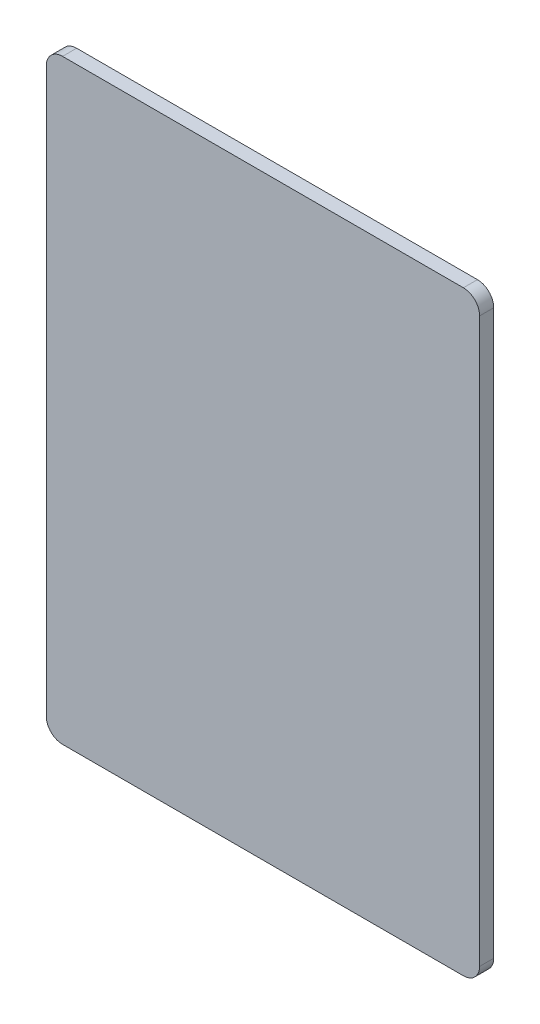
ISO-10303-21;
HEADER;
FILE_DESCRIPTION(('STEP AP214'),'2;1');
FILE_NAME('part.step','',(''),(''),'','','');
FILE_SCHEMA(('AUTOMOTIVE_DESIGN { 1 0 10303 214 1 1 1 1 }'));
ENDSEC;
DATA;
#1=APPLICATION_CONTEXT('core data for automotive mechanical design processes');
#2=APPLICATION_PROTOCOL_DEFINITION('international standard','automotive_design',2000,#1);
#3=PRODUCT_CONTEXT('',#1,'mechanical');
#4=PRODUCT('Part','Part','',(#3));
#5=PRODUCT_RELATED_PRODUCT_CATEGORY('part','',(#4));
#6=PRODUCT_DEFINITION_FORMATION('','',#4);
#7=PRODUCT_DEFINITION_CONTEXT('part definition',#1,'design');
#8=PRODUCT_DEFINITION('design','',#6,#7);
#9=PRODUCT_DEFINITION_SHAPE('','',#8);
#10=(LENGTH_UNIT() NAMED_UNIT(*) SI_UNIT(.MILLI.,.METRE.));
#11=(NAMED_UNIT(*) PLANE_ANGLE_UNIT() SI_UNIT($,.RADIAN.));
#12=(NAMED_UNIT(*) SI_UNIT($,.STERADIAN.) SOLID_ANGLE_UNIT());
#13=UNCERTAINTY_MEASURE_WITH_UNIT(LENGTH_MEASURE(1.E-05),#10,'distance_accuracy_value','');
#14=(GEOMETRIC_REPRESENTATION_CONTEXT(3) GLOBAL_UNCERTAINTY_ASSIGNED_CONTEXT((#13)) GLOBAL_UNIT_ASSIGNED_CONTEXT((#10,
#11,#12)) REPRESENTATION_CONTEXT('',''));
#15=CARTESIAN_POINT('',(0.,0.,0.));
#16=DIRECTION('',(0.,0.,1.));
#17=DIRECTION('',(1.,0.,0.));
#18=AXIS2_PLACEMENT_3D('',#15,#16,#17);
#19=CARTESIAN_POINT('',(20.,27.5,1.3));
#20=DIRECTION('',(0.,-1.,0.));
#21=DIRECTION('',(0.,0.,-1.));
#22=AXIS2_PLACEMENT_3D('',#19,#20,#21);
#23=PLANE('',#22);
#24=DIRECTION('',(-1.,0.,0.));
#25=VECTOR('',#24,1.);
#26=CARTESIAN_POINT('',(20.,27.5,0.));
#27=LINE('',#26,#25);
#28=CARTESIAN_POINT('',(18.5,27.5,0.));
#29=VERTEX_POINT('',#28);
#30=CARTESIAN_POINT('',(-18.5,27.5,0.));
#31=VERTEX_POINT('',#30);
#32=EDGE_CURVE('E142',#29,#31,#27,.T.);
#33=ORIENTED_EDGE('',*,*,#32,.T.);
#34=DIRECTION('',(0.,0.,-1.));
#35=VECTOR('',#34,1.);
#36=CARTESIAN_POINT('',(-18.5,27.5,1.3));
#37=LINE('',#36,#35);
#38=CARTESIAN_POINT('',(-18.5,27.5,1.3));
#39=VERTEX_POINT('',#38);
#40=EDGE_CURVE('E117',#31,#39,#37,.F.);
#41=ORIENTED_EDGE('',*,*,#40,.T.);
#42=DIRECTION('',(-1.,0.,0.));
#43=VECTOR('',#42,1.);
#44=CARTESIAN_POINT('',(20.,27.5,1.3));
#45=LINE('',#44,#43);
#46=CARTESIAN_POINT('',(18.5,27.5,1.3));
#47=VERTEX_POINT('',#46);
#48=EDGE_CURVE('E154',#47,#39,#45,.T.);
#49=ORIENTED_EDGE('',*,*,#48,.F.);
#50=DIRECTION('',(0.,0.,-1.));
#51=VECTOR('',#50,1.);
#52=CARTESIAN_POINT('',(18.5,27.5,1.3));
#53=LINE('',#52,#51);
#54=EDGE_CURVE('E123',#47,#29,#53,.T.);
#55=ORIENTED_EDGE('',*,*,#54,.T.);
#56=EDGE_LOOP('',(#33,#41,#49,#55));
#57=FACE_BOUND('',#56,.T.);
#58=ADVANCED_FACE('F46',(#57),#23,.F.);
#59=CARTESIAN_POINT('',(-20.,-27.5,1.3));
#60=DIRECTION('',(1.,0.,0.));
#61=DIRECTION('',(0.,0.,-1.));
#62=AXIS2_PLACEMENT_3D('',#59,#60,#61);
#63=PLANE('',#62);
#64=DIRECTION('',(0.,-1.,0.));
#65=VECTOR('',#64,1.);
#66=CARTESIAN_POINT('',(-20.,-27.5,1.3));
#67=LINE('',#66,#65);
#68=CARTESIAN_POINT('',(-20.,26.,1.3));
#69=VERTEX_POINT('',#68);
#70=CARTESIAN_POINT('',(-20.,-26.,1.3));
#71=VERTEX_POINT('',#70);
#72=EDGE_CURVE('E133',#69,#71,#67,.T.);
#73=ORIENTED_EDGE('',*,*,#72,.F.);
#74=DIRECTION('',(0.,0.,-1.));
#75=VECTOR('',#74,1.);
#76=CARTESIAN_POINT('',(-20.,26.,1.3));
#77=LINE('',#76,#75);
#78=CARTESIAN_POINT('',(-20.,26.,0.));
#79=VERTEX_POINT('',#78);
#80=EDGE_CURVE('E116',#69,#79,#77,.T.);
#81=ORIENTED_EDGE('',*,*,#80,.T.);
#82=DIRECTION('',(0.,-1.,0.));
#83=VECTOR('',#82,1.);
#84=CARTESIAN_POINT('',(-20.,-27.5,0.));
#85=LINE('',#84,#83);
#86=CARTESIAN_POINT('',(-20.,-26.,0.));
#87=VERTEX_POINT('',#86);
#88=EDGE_CURVE('E130',#79,#87,#85,.T.);
#89=ORIENTED_EDGE('',*,*,#88,.T.);
#90=DIRECTION('',(0.,0.,-1.));
#91=VECTOR('',#90,1.);
#92=CARTESIAN_POINT('',(-20.,-26.,1.3));
#93=LINE('',#92,#91);
#94=EDGE_CURVE('E136',#87,#71,#93,.F.);
#95=ORIENTED_EDGE('',*,*,#94,.T.);
#96=EDGE_LOOP('',(#73,#81,#89,#95));
#97=FACE_BOUND('',#96,.T.);
#98=ADVANCED_FACE('F129',(#97),#63,.F.);
#99=CARTESIAN_POINT('',(20.,-27.5,1.3));
#100=DIRECTION('',(0.,1.,0.));
#101=DIRECTION('',(0.,0.,1.));
#102=AXIS2_PLACEMENT_3D('',#99,#100,#101);
#103=PLANE('',#102);
#104=DIRECTION('',(1.,0.,0.));
#105=VECTOR('',#104,1.);
#106=CARTESIAN_POINT('',(20.,-27.5,1.3));
#107=LINE('',#106,#105);
#108=CARTESIAN_POINT('',(-18.5,-27.5,1.3));
#109=VERTEX_POINT('',#108);
#110=CARTESIAN_POINT('',(18.5,-27.5,1.3));
#111=VERTEX_POINT('',#110);
#112=EDGE_CURVE('E203',#109,#111,#107,.T.);
#113=ORIENTED_EDGE('',*,*,#112,.F.);
#114=DIRECTION('',(0.,0.,-1.));
#115=VECTOR('',#114,1.);
#116=CARTESIAN_POINT('',(-18.5,-27.5,1.3));
#117=LINE('',#116,#115);
#118=CARTESIAN_POINT('',(-18.5,-27.5,0.));
#119=VERTEX_POINT('',#118);
#120=EDGE_CURVE('E184',#109,#119,#117,.T.);
#121=ORIENTED_EDGE('',*,*,#120,.T.);
#122=DIRECTION('',(1.,0.,0.));
#123=VECTOR('',#122,1.);
#124=CARTESIAN_POINT('',(20.,-27.5,0.));
#125=LINE('',#124,#123);
#126=CARTESIAN_POINT('',(18.5,-27.5,0.));
#127=VERTEX_POINT('',#126);
#128=EDGE_CURVE('E141',#119,#127,#125,.T.);
#129=ORIENTED_EDGE('',*,*,#128,.T.);
#130=DIRECTION('',(0.,0.,-1.));
#131=VECTOR('',#130,1.);
#132=CARTESIAN_POINT('',(18.5,-27.5,1.3));
#133=LINE('',#132,#131);
#134=EDGE_CURVE('E181',#127,#111,#133,.F.);
#135=ORIENTED_EDGE('',*,*,#134,.T.);
#136=EDGE_LOOP('',(#113,#121,#129,#135));
#137=FACE_BOUND('',#136,.T.);
#138=ADVANCED_FACE('F217',(#137),#103,.F.);
#139=CARTESIAN_POINT('',(20.,-27.5,1.3));
#140=DIRECTION('',(-1.,0.,0.));
#141=DIRECTION('',(0.,0.,1.));
#142=AXIS2_PLACEMENT_3D('',#139,#140,#141);
#143=PLANE('',#142);
#144=DIRECTION('',(0.,1.,0.));
#145=VECTOR('',#144,1.);
#146=CARTESIAN_POINT('',(20.,-27.5,0.));
#147=LINE('',#146,#145);
#148=CARTESIAN_POINT('',(20.,-26.,0.));
#149=VERTEX_POINT('',#148);
#150=CARTESIAN_POINT('',(20.,26.,0.));
#151=VERTEX_POINT('',#150);
#152=EDGE_CURVE('E147',#149,#151,#147,.T.);
#153=ORIENTED_EDGE('',*,*,#152,.T.);
#154=DIRECTION('',(0.,0.,-1.));
#155=VECTOR('',#154,1.);
#156=CARTESIAN_POINT('',(20.,26.,1.3));
#157=LINE('',#156,#155);
#158=CARTESIAN_POINT('',(20.,26.,1.3));
#159=VERTEX_POINT('',#158);
#160=EDGE_CURVE('E11',#151,#159,#157,.F.);
#161=ORIENTED_EDGE('',*,*,#160,.T.);
#162=DIRECTION('',(0.,1.,0.));
#163=VECTOR('',#162,1.);
#164=CARTESIAN_POINT('',(20.,-27.5,1.3));
#165=LINE('',#164,#163);
#166=CARTESIAN_POINT('',(20.,-26.,1.3));
#167=VERTEX_POINT('',#166);
#168=EDGE_CURVE('E156',#167,#159,#165,.T.);
#169=ORIENTED_EDGE('',*,*,#168,.F.);
#170=DIRECTION('',(0.,0.,-1.));
#171=VECTOR('',#170,1.);
#172=CARTESIAN_POINT('',(20.,-26.,1.3));
#173=LINE('',#172,#171);
#174=EDGE_CURVE('E55',#167,#149,#173,.T.);
#175=ORIENTED_EDGE('',*,*,#174,.T.);
#176=EDGE_LOOP('',(#153,#161,#169,#175));
#177=FACE_BOUND('',#176,.T.);
#178=ADVANCED_FACE('F191',(#177),#143,.F.);
#179=CARTESIAN_POINT('',(0.,0.,1.3));
#180=DIRECTION('',(0.,0.,-1.));
#181=DIRECTION('',(-1.,0.,0.));
#182=AXIS2_PLACEMENT_3D('',#179,#180,#181);
#183=PLANE('',#182);
#184=ORIENTED_EDGE('',*,*,#48,.T.);
#185=CARTESIAN_POINT('',(-18.5,26.,1.3));
#186=DIRECTION('',(0.,0.,-1.));
#187=DIRECTION('',(-1.,0.,0.));
#188=AXIS2_PLACEMENT_3D('',#185,#186,#187);
#189=CIRCLE('',#188,1.5);
#190=EDGE_CURVE('E178',#39,#69,#189,.F.);
#191=ORIENTED_EDGE('',*,*,#190,.T.);
#192=ORIENTED_EDGE('',*,*,#72,.T.);
#193=CARTESIAN_POINT('',(-18.5,-26.,1.3));
#194=DIRECTION('',(0.,0.,-1.));
#195=DIRECTION('',(-1.,0.,0.));
#196=AXIS2_PLACEMENT_3D('',#193,#194,#195);
#197=CIRCLE('',#196,1.5);
#198=EDGE_CURVE('E175',#71,#109,#197,.F.);
#199=ORIENTED_EDGE('',*,*,#198,.T.);
#200=ORIENTED_EDGE('',*,*,#112,.T.);
#201=CARTESIAN_POINT('',(18.5,-26.,1.3));
#202=DIRECTION('',(0.,0.,-1.));
#203=DIRECTION('',(-1.,0.,0.));
#204=AXIS2_PLACEMENT_3D('',#201,#202,#203);
#205=CIRCLE('',#204,1.5);
#206=EDGE_CURVE('E67',#111,#167,#205,.F.);
#207=ORIENTED_EDGE('',*,*,#206,.T.);
#208=ORIENTED_EDGE('',*,*,#168,.T.);
#209=CARTESIAN_POINT('',(18.5,26.,1.3));
#210=DIRECTION('',(0.,0.,-1.));
#211=DIRECTION('',(-1.,0.,0.));
#212=AXIS2_PLACEMENT_3D('',#209,#210,#211);
#213=CIRCLE('',#212,1.5);
#214=EDGE_CURVE('E172',#159,#47,#213,.F.);
#215=ORIENTED_EDGE('',*,*,#214,.T.);
#216=EDGE_LOOP('',(#184,#191,#192,#199,#200,#207,#208,#215));
#217=FACE_BOUND('',#216,.T.);
#218=ADVANCED_FACE('F208',(#217),#183,.F.);
#219=CARTESIAN_POINT('',(0.,0.,0.));
#220=DIRECTION('',(0.,0.,-1.));
#221=DIRECTION('',(-1.,0.,0.));
#222=AXIS2_PLACEMENT_3D('',#219,#220,#221);
#223=PLANE('',#222);
#224=ORIENTED_EDGE('',*,*,#88,.F.);
#225=CARTESIAN_POINT('',(-18.5,26.,0.));
#226=DIRECTION('',(0.,0.,-1.));
#227=DIRECTION('',(-1.,0.,0.));
#228=AXIS2_PLACEMENT_3D('',#225,#226,#227);
#229=CIRCLE('',#228,1.5);
#230=EDGE_CURVE('E112',#79,#31,#229,.T.);
#231=ORIENTED_EDGE('',*,*,#230,.T.);
#232=ORIENTED_EDGE('',*,*,#32,.F.);
#233=CARTESIAN_POINT('',(18.5,26.,0.));
#234=DIRECTION('',(0.,0.,-1.));
#235=DIRECTION('',(-1.,0.,0.));
#236=AXIS2_PLACEMENT_3D('',#233,#234,#235);
#237=CIRCLE('',#236,1.5);
#238=EDGE_CURVE('E160',#29,#151,#237,.T.);
#239=ORIENTED_EDGE('',*,*,#238,.T.);
#240=ORIENTED_EDGE('',*,*,#152,.F.);
#241=CARTESIAN_POINT('',(18.5,-26.,0.));
#242=DIRECTION('',(0.,0.,-1.));
#243=DIRECTION('',(-1.,0.,0.));
#244=AXIS2_PLACEMENT_3D('',#241,#242,#243);
#245=CIRCLE('',#244,1.5);
#246=EDGE_CURVE('E135',#149,#127,#245,.T.);
#247=ORIENTED_EDGE('',*,*,#246,.T.);
#248=ORIENTED_EDGE('',*,*,#128,.F.);
#249=CARTESIAN_POINT('',(-18.5,-26.,0.));
#250=DIRECTION('',(0.,0.,-1.));
#251=DIRECTION('',(-1.,0.,0.));
#252=AXIS2_PLACEMENT_3D('',#249,#250,#251);
#253=CIRCLE('',#252,1.5);
#254=EDGE_CURVE('E124',#119,#87,#253,.T.);
#255=ORIENTED_EDGE('',*,*,#254,.T.);
#256=EDGE_LOOP('',(#224,#231,#232,#239,#240,#247,#248,#255));
#257=FACE_BOUND('',#256,.T.);
#258=ADVANCED_FACE('F138',(#257),#223,.T.);
#259=CARTESIAN_POINT('',(-18.5,26.,1.3));
#260=DIRECTION('',(0.,0.,-1.));
#261=DIRECTION('',(-1.,0.,0.));
#262=AXIS2_PLACEMENT_3D('',#259,#260,#261);
#263=CYLINDRICAL_SURFACE('',#262,1.5);
#264=ORIENTED_EDGE('',*,*,#190,.F.);
#265=ORIENTED_EDGE('',*,*,#40,.F.);
#266=ORIENTED_EDGE('',*,*,#230,.F.);
#267=ORIENTED_EDGE('',*,*,#80,.F.);
#268=EDGE_LOOP('',(#264,#265,#266,#267));
#269=FACE_BOUND('',#268,.T.);
#270=ADVANCED_FACE('F115',(#269),#263,.T.);
#271=CARTESIAN_POINT('',(-18.5,-26.,1.3));
#272=DIRECTION('',(0.,0.,-1.));
#273=DIRECTION('',(-1.,0.,0.));
#274=AXIS2_PLACEMENT_3D('',#271,#272,#273);
#275=CYLINDRICAL_SURFACE('',#274,1.5);
#276=ORIENTED_EDGE('',*,*,#198,.F.);
#277=ORIENTED_EDGE('',*,*,#94,.F.);
#278=ORIENTED_EDGE('',*,*,#254,.F.);
#279=ORIENTED_EDGE('',*,*,#120,.F.);
#280=EDGE_LOOP('',(#276,#277,#278,#279));
#281=FACE_BOUND('',#280,.T.);
#282=ADVANCED_FACE('F229',(#281),#275,.T.);
#283=CARTESIAN_POINT('',(18.5,26.,1.3));
#284=DIRECTION('',(0.,0.,-1.));
#285=DIRECTION('',(-1.,0.,0.));
#286=AXIS2_PLACEMENT_3D('',#283,#284,#285);
#287=CYLINDRICAL_SURFACE('',#286,1.5);
#288=ORIENTED_EDGE('',*,*,#214,.F.);
#289=ORIENTED_EDGE('',*,*,#160,.F.);
#290=ORIENTED_EDGE('',*,*,#238,.F.);
#291=ORIENTED_EDGE('',*,*,#54,.F.);
#292=EDGE_LOOP('',(#288,#289,#290,#291));
#293=FACE_BOUND('',#292,.T.);
#294=ADVANCED_FACE('F196',(#293),#287,.T.);
#295=CARTESIAN_POINT('',(18.5,-26.,1.3));
#296=DIRECTION('',(0.,0.,-1.));
#297=DIRECTION('',(-1.,0.,0.));
#298=AXIS2_PLACEMENT_3D('',#295,#296,#297);
#299=CYLINDRICAL_SURFACE('',#298,1.5);
#300=ORIENTED_EDGE('',*,*,#206,.F.);
#301=ORIENTED_EDGE('',*,*,#134,.F.);
#302=ORIENTED_EDGE('',*,*,#246,.F.);
#303=ORIENTED_EDGE('',*,*,#174,.F.);
#304=EDGE_LOOP('',(#300,#301,#302,#303));
#305=FACE_BOUND('',#304,.T.);
#306=ADVANCED_FACE('F48',(#305),#299,.T.);
#307=CLOSED_SHELL('',(#58,#98,#138,#178,#218,#258,#270,#282,#294,#306));
#308=MANIFOLD_SOLID_BREP('B2',#307);
#309=ADVANCED_BREP_SHAPE_REPRESENTATION('',(#18,#308),#14);
#310=SHAPE_DEFINITION_REPRESENTATION(#9,#309);
ENDSEC;
END-ISO-10303-21;
